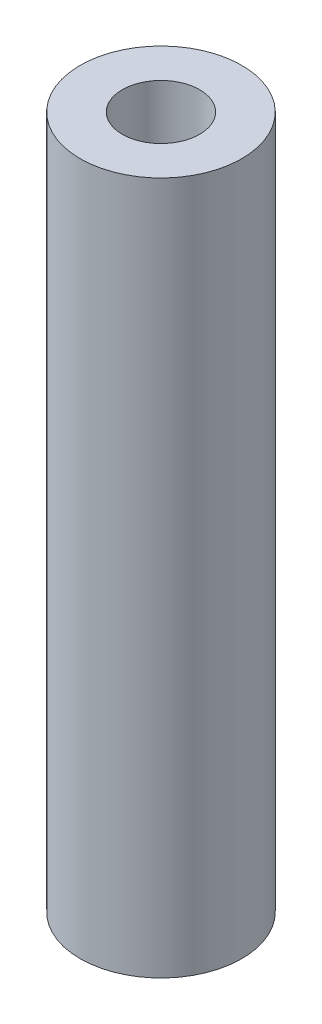
ISO-10303-21;
HEADER;
FILE_DESCRIPTION(('STEP AP214'),'2;1');
FILE_NAME('part.step','',(''),(''),'','','');
FILE_SCHEMA(('AUTOMOTIVE_DESIGN { 1 0 10303 214 1 1 1 1 }'));
ENDSEC;
DATA;
#1=APPLICATION_CONTEXT('core data for automotive mechanical design processes');
#2=APPLICATION_PROTOCOL_DEFINITION('international standard','automotive_design',2000,#1);
#3=PRODUCT_CONTEXT('',#1,'mechanical');
#4=PRODUCT('Part','Part','',(#3));
#5=PRODUCT_RELATED_PRODUCT_CATEGORY('part','',(#4));
#6=PRODUCT_DEFINITION_FORMATION('','',#4);
#7=PRODUCT_DEFINITION_CONTEXT('part definition',#1,'design');
#8=PRODUCT_DEFINITION('design','',#6,#7);
#9=PRODUCT_DEFINITION_SHAPE('','',#8);
#10=(LENGTH_UNIT() NAMED_UNIT(*) SI_UNIT(.MILLI.,.METRE.));
#11=(NAMED_UNIT(*) PLANE_ANGLE_UNIT() SI_UNIT($,.RADIAN.));
#12=(NAMED_UNIT(*) SI_UNIT($,.STERADIAN.) SOLID_ANGLE_UNIT());
#13=UNCERTAINTY_MEASURE_WITH_UNIT(LENGTH_MEASURE(1.E-05),#10,'distance_accuracy_value','');
#14=(GEOMETRIC_REPRESENTATION_CONTEXT(3) GLOBAL_UNCERTAINTY_ASSIGNED_CONTEXT((#13)) GLOBAL_UNIT_ASSIGNED_CONTEXT((#10,
#11,#12)) REPRESENTATION_CONTEXT('',''));
#15=CARTESIAN_POINT('',(0.,0.,0.));
#16=DIRECTION('',(0.,0.,1.));
#17=DIRECTION('',(1.,0.,0.));
#18=AXIS2_PLACEMENT_3D('',#15,#16,#17);
#19=CARTESIAN_POINT('',(0.,30.,0.));
#20=DIRECTION('',(0.,1.,0.));
#21=DIRECTION('',(0.,0.,1.));
#22=AXIS2_PLACEMENT_3D('',#19,#20,#21);
#23=PLANE('',#22);
#24=CARTESIAN_POINT('',(0.,30.,0.));
#25=DIRECTION('',(0.,1.,0.));
#26=DIRECTION('',(0.,0.,1.));
#27=AXIS2_PLACEMENT_3D('',#24,#25,#26);
#28=CIRCLE('',#27,3.5);
#29=CARTESIAN_POINT('',(0.,30.,3.5));
#30=VERTEX_POINT('',#29);
#31=EDGE_CURVE('E10',#30,#30,#28,.T.);
#32=ORIENTED_EDGE('',*,*,#31,.T.);
#33=EDGE_LOOP('',(#32));
#34=FACE_BOUND('',#33,.T.);
#35=CARTESIAN_POINT('',(0.,30.,0.));
#36=DIRECTION('',(0.,1.,0.));
#37=DIRECTION('',(0.,0.,1.));
#38=AXIS2_PLACEMENT_3D('',#35,#36,#37);
#39=CIRCLE('',#38,1.675);
#40=CARTESIAN_POINT('',(0.,30.,1.675));
#41=VERTEX_POINT('',#40);
#42=EDGE_CURVE('E46',#41,#41,#39,.T.);
#43=ORIENTED_EDGE('',*,*,#42,.F.);
#44=EDGE_LOOP('',(#43));
#45=FACE_BOUND('',#44,.T.);
#46=ADVANCED_FACE('F35',(#34,#45),#23,.T.);
#47=CARTESIAN_POINT('',(0.,0.,0.));
#48=DIRECTION('',(0.,1.,0.));
#49=DIRECTION('',(0.,0.,1.));
#50=AXIS2_PLACEMENT_3D('',#47,#48,#49);
#51=PLANE('',#50);
#52=CARTESIAN_POINT('',(0.,0.,0.));
#53=DIRECTION('',(0.,1.,0.));
#54=DIRECTION('',(0.,0.,1.));
#55=AXIS2_PLACEMENT_3D('',#52,#53,#54);
#56=CIRCLE('',#55,3.5);
#57=CARTESIAN_POINT('',(0.,0.,3.5));
#58=VERTEX_POINT('',#57);
#59=EDGE_CURVE('E39',#58,#58,#56,.T.);
#60=ORIENTED_EDGE('',*,*,#59,.F.);
#61=EDGE_LOOP('',(#60));
#62=FACE_BOUND('',#61,.T.);
#63=CARTESIAN_POINT('',(0.,0.,0.));
#64=DIRECTION('',(0.,1.,0.));
#65=DIRECTION('',(0.,0.,1.));
#66=AXIS2_PLACEMENT_3D('',#63,#64,#65);
#67=CIRCLE('',#66,1.675);
#68=CARTESIAN_POINT('',(0.,0.,1.675));
#69=VERTEX_POINT('',#68);
#70=EDGE_CURVE('E48',#69,#69,#67,.T.);
#71=ORIENTED_EDGE('',*,*,#70,.T.);
#72=EDGE_LOOP('',(#71));
#73=FACE_BOUND('',#72,.T.);
#74=ADVANCED_FACE('F58',(#62,#73),#51,.F.);
#75=CARTESIAN_POINT('',(0.,30.,0.));
#76=DIRECTION('',(0.,-1.,0.));
#77=DIRECTION('',(0.,0.,-1.));
#78=AXIS2_PLACEMENT_3D('',#75,#76,#77);
#79=CYLINDRICAL_SURFACE('',#78,3.5);
#80=ORIENTED_EDGE('',*,*,#31,.F.);
#81=EDGE_LOOP('',(#80));
#82=FACE_BOUND('',#81,.T.);
#83=ORIENTED_EDGE('',*,*,#59,.T.);
#84=EDGE_LOOP('',(#83));
#85=FACE_BOUND('',#84,.T.);
#86=ADVANCED_FACE('F37',(#82,#85),#79,.T.);
#87=CARTESIAN_POINT('',(0.,30.,0.));
#88=DIRECTION('',(0.,-1.,0.));
#89=DIRECTION('',(0.,0.,-1.));
#90=AXIS2_PLACEMENT_3D('',#87,#88,#89);
#91=CYLINDRICAL_SURFACE('',#90,1.675);
#92=ORIENTED_EDGE('',*,*,#42,.T.);
#93=EDGE_LOOP('',(#92));
#94=FACE_BOUND('',#93,.T.);
#95=ORIENTED_EDGE('',*,*,#70,.F.);
#96=EDGE_LOOP('',(#95));
#97=FACE_BOUND('',#96,.T.);
#98=ADVANCED_FACE('F54',(#94,#97),#91,.F.);
#99=CLOSED_SHELL('',(#46,#74,#86,#98));
#100=MANIFOLD_SOLID_BREP('B2',#99);
#101=ADVANCED_BREP_SHAPE_REPRESENTATION('',(#18,#100),#14);
#102=SHAPE_DEFINITION_REPRESENTATION(#9,#101);
ENDSEC;
END-ISO-10303-21;
